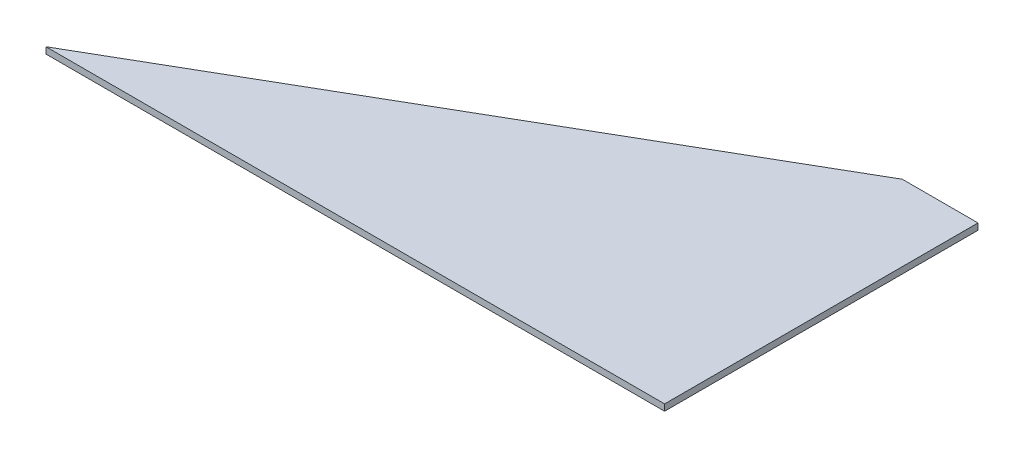
ISO-10303-21;
HEADER;
FILE_DESCRIPTION(('STEP AP214'),'2;1');
FILE_NAME('part.step','',(''),(''),'','','');
FILE_SCHEMA(('AUTOMOTIVE_DESIGN { 1 0 10303 214 1 1 1 1 }'));
ENDSEC;
DATA;
#1=APPLICATION_CONTEXT('core data for automotive mechanical design processes');
#2=APPLICATION_PROTOCOL_DEFINITION('international standard','automotive_design',2000,#1);
#3=PRODUCT_CONTEXT('',#1,'mechanical');
#4=PRODUCT('Part','Part','',(#3));
#5=PRODUCT_RELATED_PRODUCT_CATEGORY('part','',(#4));
#6=PRODUCT_DEFINITION_FORMATION('','',#4);
#7=PRODUCT_DEFINITION_CONTEXT('part definition',#1,'design');
#8=PRODUCT_DEFINITION('design','',#6,#7);
#9=PRODUCT_DEFINITION_SHAPE('','',#8);
#10=(LENGTH_UNIT() NAMED_UNIT(*) SI_UNIT(.MILLI.,.METRE.));
#11=(NAMED_UNIT(*) PLANE_ANGLE_UNIT() SI_UNIT($,.RADIAN.));
#12=(NAMED_UNIT(*) SI_UNIT($,.STERADIAN.) SOLID_ANGLE_UNIT());
#13=UNCERTAINTY_MEASURE_WITH_UNIT(LENGTH_MEASURE(1.E-05),#10,'distance_accuracy_value','');
#14=(GEOMETRIC_REPRESENTATION_CONTEXT(3) GLOBAL_UNCERTAINTY_ASSIGNED_CONTEXT((#13)) GLOBAL_UNIT_ASSIGNED_CONTEXT((#10,
#11,#12)) REPRESENTATION_CONTEXT('',''));
#15=CARTESIAN_POINT('',(0.,0.,0.));
#16=DIRECTION('',(0.,0.,1.));
#17=DIRECTION('',(1.,0.,0.));
#18=AXIS2_PLACEMENT_3D('',#15,#16,#17);
#19=CARTESIAN_POINT('',(334.355087893101,3.937,-193.04));
#20=DIRECTION('',(0.499999999999995,0.,0.866025403784442));
#21=DIRECTION('',(0.866025403784442,0.,-0.499999999999995));
#22=AXIS2_PLACEMENT_3D('',#19,#20,#21);
#23=PLANE('',#22);
#24=DIRECTION('',(-0.866025403784442,0.,0.499999999999995));
#25=VECTOR('',#24,1.);
#26=CARTESIAN_POINT('',(334.355087893101,0.,-193.04));
#27=LINE('',#26,#25);
#28=CARTESIAN_POINT('',(334.355087893101,0.,-193.04));
#29=VERTEX_POINT('',#28);
#30=CARTESIAN_POINT('',(0.,0.,0.));
#31=VERTEX_POINT('',#30);
#32=EDGE_CURVE('E95',#29,#31,#27,.T.);
#33=ORIENTED_EDGE('',*,*,#32,.T.);
#34=DIRECTION('',(0.,-1.,0.));
#35=VECTOR('',#34,1.);
#36=CARTESIAN_POINT('',(0.,3.937,0.));
#37=LINE('',#36,#35);
#38=CARTESIAN_POINT('',(0.,3.937,0.));
#39=VERTEX_POINT('',#38);
#40=EDGE_CURVE('E11',#39,#31,#37,.T.);
#41=ORIENTED_EDGE('',*,*,#40,.F.);
#42=DIRECTION('',(-0.866025403784442,0.,0.499999999999995));
#43=VECTOR('',#42,1.);
#44=CARTESIAN_POINT('',(334.355087893101,3.937,-193.04));
#45=LINE('',#44,#43);
#46=CARTESIAN_POINT('',(334.355087893101,3.937,-193.04));
#47=VERTEX_POINT('',#46);
#48=EDGE_CURVE('E83',#47,#39,#45,.T.);
#49=ORIENTED_EDGE('',*,*,#48,.F.);
#50=DIRECTION('',(0.,-1.,0.));
#51=VECTOR('',#50,1.);
#52=CARTESIAN_POINT('',(334.355087893101,3.937,-193.04));
#53=LINE('',#52,#51);
#54=EDGE_CURVE('E91',#47,#29,#53,.T.);
#55=ORIENTED_EDGE('',*,*,#54,.T.);
#56=EDGE_LOOP('',(#33,#41,#49,#55));
#57=FACE_BOUND('',#56,.T.);
#58=ADVANCED_FACE('F32',(#57),#23,.F.);
#59=CARTESIAN_POINT('',(0.,3.937,0.));
#60=DIRECTION('',(0.,0.,-1.));
#61=DIRECTION('',(-1.,0.,0.));
#62=AXIS2_PLACEMENT_3D('',#59,#60,#61);
#63=PLANE('',#62);
#64=DIRECTION('',(1.,0.,0.));
#65=VECTOR('',#64,1.);
#66=CARTESIAN_POINT('',(0.,0.,0.));
#67=LINE('',#66,#65);
#68=CARTESIAN_POINT('',(381.,0.,0.));
#69=VERTEX_POINT('',#68);
#70=EDGE_CURVE('E87',#31,#69,#67,.T.);
#71=ORIENTED_EDGE('',*,*,#70,.T.);
#72=DIRECTION('',(0.,-1.,0.));
#73=VECTOR('',#72,1.);
#74=CARTESIAN_POINT('',(381.,3.937,0.));
#75=LINE('',#74,#73);
#76=CARTESIAN_POINT('',(381.,3.937,0.));
#77=VERTEX_POINT('',#76);
#78=EDGE_CURVE('E40',#77,#69,#75,.T.);
#79=ORIENTED_EDGE('',*,*,#78,.F.);
#80=DIRECTION('',(1.,0.,0.));
#81=VECTOR('',#80,1.);
#82=CARTESIAN_POINT('',(0.,3.937,0.));
#83=LINE('',#82,#81);
#84=EDGE_CURVE('E78',#39,#77,#83,.T.);
#85=ORIENTED_EDGE('',*,*,#84,.F.);
#86=ORIENTED_EDGE('',*,*,#40,.T.);
#87=EDGE_LOOP('',(#71,#79,#85,#86));
#88=FACE_BOUND('',#87,.T.);
#89=ADVANCED_FACE('F86',(#88),#63,.F.);
#90=CARTESIAN_POINT('',(381.,3.937,0.));
#91=DIRECTION('',(-1.,0.,0.));
#92=DIRECTION('',(0.,0.,1.));
#93=AXIS2_PLACEMENT_3D('',#90,#91,#92);
#94=PLANE('',#93);
#95=DIRECTION('',(0.,0.,-1.));
#96=VECTOR('',#95,1.);
#97=CARTESIAN_POINT('',(381.,0.,0.));
#98=LINE('',#97,#96);
#99=CARTESIAN_POINT('',(381.,0.,-193.04));
#100=VERTEX_POINT('',#99);
#101=EDGE_CURVE('E65',#69,#100,#98,.T.);
#102=ORIENTED_EDGE('',*,*,#101,.T.);
#103=DIRECTION('',(0.,-1.,0.));
#104=VECTOR('',#103,1.);
#105=CARTESIAN_POINT('',(381.,3.937,-193.04));
#106=LINE('',#105,#104);
#107=CARTESIAN_POINT('',(381.,3.937,-193.04));
#108=VERTEX_POINT('',#107);
#109=EDGE_CURVE('E88',#108,#100,#106,.T.);
#110=ORIENTED_EDGE('',*,*,#109,.F.);
#111=DIRECTION('',(0.,0.,-1.));
#112=VECTOR('',#111,1.);
#113=CARTESIAN_POINT('',(381.,3.937,0.));
#114=LINE('',#113,#112);
#115=EDGE_CURVE('E81',#77,#108,#114,.T.);
#116=ORIENTED_EDGE('',*,*,#115,.F.);
#117=ORIENTED_EDGE('',*,*,#78,.T.);
#118=EDGE_LOOP('',(#102,#110,#116,#117));
#119=FACE_BOUND('',#118,.T.);
#120=ADVANCED_FACE('F89',(#119),#94,.F.);
#121=CARTESIAN_POINT('',(381.,3.937,-193.04));
#122=DIRECTION('',(0.,0.,1.));
#123=DIRECTION('',(1.,0.,0.));
#124=AXIS2_PLACEMENT_3D('',#121,#122,#123);
#125=PLANE('',#124);
#126=DIRECTION('',(-1.,0.,0.));
#127=VECTOR('',#126,1.);
#128=CARTESIAN_POINT('',(381.,0.,-193.04));
#129=LINE('',#128,#127);
#130=EDGE_CURVE('E71',#100,#29,#129,.T.);
#131=ORIENTED_EDGE('',*,*,#130,.T.);
#132=ORIENTED_EDGE('',*,*,#54,.F.);
#133=DIRECTION('',(-1.,0.,0.));
#134=VECTOR('',#133,1.);
#135=CARTESIAN_POINT('',(381.,3.937,-193.04));
#136=LINE('',#135,#134);
#137=EDGE_CURVE('E48',#108,#47,#136,.T.);
#138=ORIENTED_EDGE('',*,*,#137,.F.);
#139=ORIENTED_EDGE('',*,*,#109,.T.);
#140=EDGE_LOOP('',(#131,#132,#138,#139));
#141=FACE_BOUND('',#140,.T.);
#142=ADVANCED_FACE('F102',(#141),#125,.F.);
#143=CARTESIAN_POINT('',(0.,3.937,0.));
#144=DIRECTION('',(0.,-1.,0.));
#145=DIRECTION('',(0.,0.,-1.));
#146=AXIS2_PLACEMENT_3D('',#143,#144,#145);
#147=PLANE('',#146);
#148=ORIENTED_EDGE('',*,*,#48,.T.);
#149=ORIENTED_EDGE('',*,*,#84,.T.);
#150=ORIENTED_EDGE('',*,*,#115,.T.);
#151=ORIENTED_EDGE('',*,*,#137,.T.);
#152=EDGE_LOOP('',(#148,#149,#150,#151));
#153=FACE_BOUND('',#152,.T.);
#154=ADVANCED_FACE('F79',(#153),#147,.F.);
#155=CARTESIAN_POINT('',(0.,0.,0.));
#156=DIRECTION('',(0.,-1.,0.));
#157=DIRECTION('',(0.,0.,-1.));
#158=AXIS2_PLACEMENT_3D('',#155,#156,#157);
#159=PLANE('',#158);
#160=ORIENTED_EDGE('',*,*,#32,.F.);
#161=ORIENTED_EDGE('',*,*,#130,.F.);
#162=ORIENTED_EDGE('',*,*,#101,.F.);
#163=ORIENTED_EDGE('',*,*,#70,.F.);
#164=EDGE_LOOP('',(#160,#161,#162,#163));
#165=FACE_BOUND('',#164,.T.);
#166=ADVANCED_FACE('F105',(#165),#159,.T.);
#167=CLOSED_SHELL('',(#58,#89,#120,#142,#154,#166));
#168=MANIFOLD_SOLID_BREP('B2',#167);
#169=ADVANCED_BREP_SHAPE_REPRESENTATION('',(#18,#168),#14);
#170=SHAPE_DEFINITION_REPRESENTATION(#9,#169);
ENDSEC;
END-ISO-10303-21;
